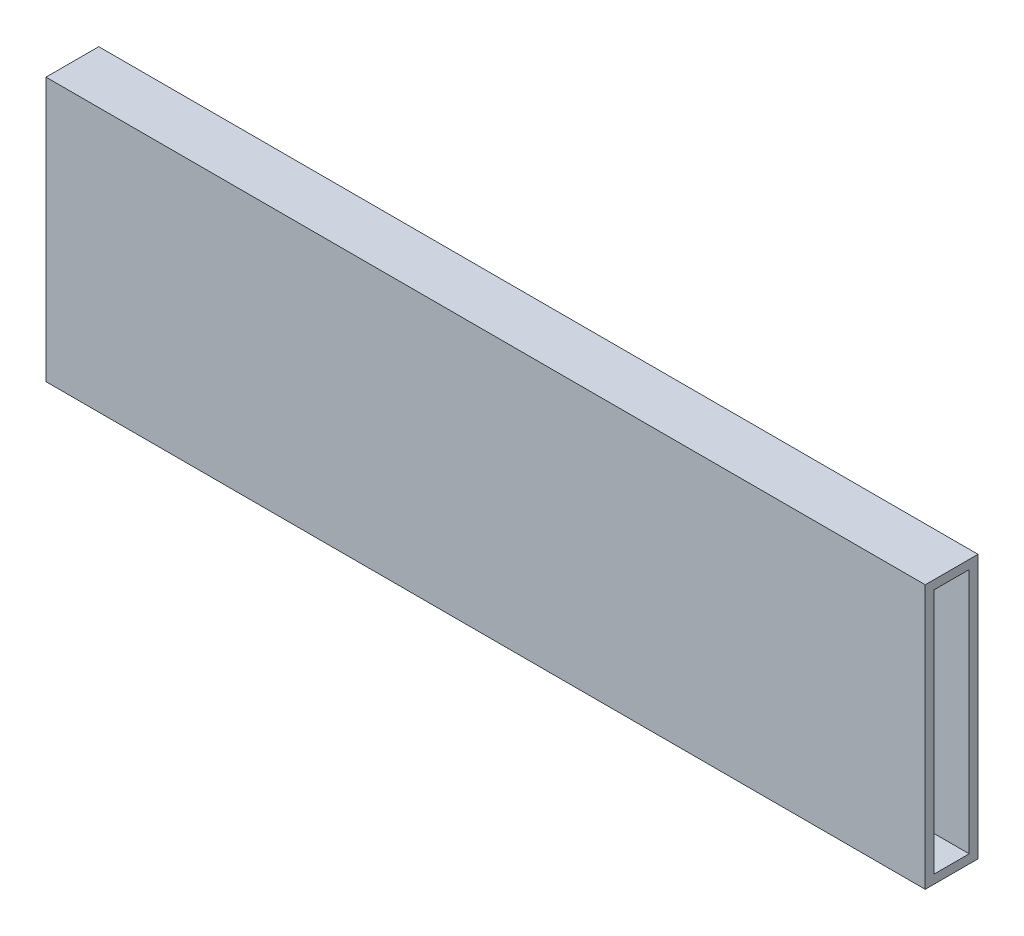
ISO-10303-21;
HEADER;
FILE_DESCRIPTION(('STEP AP214'),'2;1');
FILE_NAME('part.step','',(''),(''),'','','');
FILE_SCHEMA(('AUTOMOTIVE_DESIGN { 1 0 10303 214 1 1 1 1 }'));
ENDSEC;
DATA;
#1=APPLICATION_CONTEXT('core data for automotive mechanical design processes');
#2=APPLICATION_PROTOCOL_DEFINITION('international standard','automotive_design',2000,#1);
#3=PRODUCT_CONTEXT('',#1,'mechanical');
#4=PRODUCT('Part','Part','',(#3));
#5=PRODUCT_RELATED_PRODUCT_CATEGORY('part','',(#4));
#6=PRODUCT_DEFINITION_FORMATION('','',#4);
#7=PRODUCT_DEFINITION_CONTEXT('part definition',#1,'design');
#8=PRODUCT_DEFINITION('design','',#6,#7);
#9=PRODUCT_DEFINITION_SHAPE('','',#8);
#10=(LENGTH_UNIT() NAMED_UNIT(*) SI_UNIT(.MILLI.,.METRE.));
#11=(NAMED_UNIT(*) PLANE_ANGLE_UNIT() SI_UNIT($,.RADIAN.));
#12=(NAMED_UNIT(*) SI_UNIT($,.STERADIAN.) SOLID_ANGLE_UNIT());
#13=UNCERTAINTY_MEASURE_WITH_UNIT(LENGTH_MEASURE(1.E-05),#10,'distance_accuracy_value','');
#14=(GEOMETRIC_REPRESENTATION_CONTEXT(3) GLOBAL_UNCERTAINTY_ASSIGNED_CONTEXT((#13)) GLOBAL_UNIT_ASSIGNED_CONTEXT((#10,
#11,#12)) REPRESENTATION_CONTEXT('',''));
#15=CARTESIAN_POINT('',(0.,0.,0.));
#16=DIRECTION('',(0.,0.,1.));
#17=DIRECTION('',(1.,0.,0.));
#18=AXIS2_PLACEMENT_3D('',#15,#16,#17);
#19=CARTESIAN_POINT('',(-27.6006479437073,15.6987577639752,6.));
#20=DIRECTION('',(1.,0.,0.));
#21=DIRECTION('',(0.,0.,-1.));
#22=AXIS2_PLACEMENT_3D('',#19,#20,#21);
#23=PLANE('',#22);
#24=DIRECTION('',(0.,0.,-1.));
#25=VECTOR('',#24,1.);
#26=CARTESIAN_POINT('',(-27.6006479437073,-13.3012422360248,0.999999999999997));
#27=LINE('',#26,#25);
#28=CARTESIAN_POINT('',(-27.6006479437073,-13.3012422360248,5.));
#29=VERTEX_POINT('',#28);
#30=CARTESIAN_POINT('',(-27.6006479437073,-13.3012422360248,0.999999999999997));
#31=VERTEX_POINT('',#30);
#32=EDGE_CURVE('E111',#29,#31,#27,.T.);
#33=ORIENTED_EDGE('',*,*,#32,.T.);
#34=DIRECTION('',(0.,1.,0.));
#35=VECTOR('',#34,1.);
#36=CARTESIAN_POINT('',(-27.6006479437073,14.6987577639752,1.));
#37=LINE('',#36,#35);
#38=CARTESIAN_POINT('',(-27.6006479437073,14.6987577639752,1.));
#39=VERTEX_POINT('',#38);
#40=EDGE_CURVE('E105',#31,#39,#37,.T.);
#41=ORIENTED_EDGE('',*,*,#40,.T.);
#42=DIRECTION('',(0.,0.,1.));
#43=VECTOR('',#42,1.);
#44=CARTESIAN_POINT('',(-27.6006479437073,14.6987577639752,1.));
#45=LINE('',#44,#43);
#46=CARTESIAN_POINT('',(-27.6006479437073,14.6987577639752,5.));
#47=VERTEX_POINT('',#46);
#48=EDGE_CURVE('E114',#39,#47,#45,.T.);
#49=ORIENTED_EDGE('',*,*,#48,.T.);
#50=DIRECTION('',(0.,-1.,0.));
#51=VECTOR('',#50,1.);
#52=CARTESIAN_POINT('',(-27.6006479437073,14.6987577639752,5.));
#53=LINE('',#52,#51);
#54=EDGE_CURVE('E53',#47,#29,#53,.T.);
#55=ORIENTED_EDGE('',*,*,#54,.T.);
#56=EDGE_LOOP('',(#33,#41,#49,#55));
#57=FACE_BOUND('',#56,.T.);
#58=DIRECTION('',(0.,-1.,0.));
#59=VECTOR('',#58,1.);
#60=CARTESIAN_POINT('',(-27.6006479437073,15.6987577639752,0.));
#61=LINE('',#60,#59);
#62=CARTESIAN_POINT('',(-27.6006479437073,15.6987577639752,0.));
#63=VERTEX_POINT('',#62);
#64=CARTESIAN_POINT('',(-27.6006479437073,-14.3012422360248,0.));
#65=VERTEX_POINT('',#64);
#66=EDGE_CURVE('E135',#63,#65,#61,.T.);
#67=ORIENTED_EDGE('',*,*,#66,.T.);
#68=DIRECTION('',(0.,0.,-1.));
#69=VECTOR('',#68,1.);
#70=CARTESIAN_POINT('',(-27.6006479437073,-14.3012422360248,6.));
#71=LINE('',#70,#69);
#72=CARTESIAN_POINT('',(-27.6006479437073,-14.3012422360248,6.));
#73=VERTEX_POINT('',#72);
#74=EDGE_CURVE('E11',#73,#65,#71,.T.);
#75=ORIENTED_EDGE('',*,*,#74,.F.);
#76=DIRECTION('',(0.,-1.,0.));
#77=VECTOR('',#76,1.);
#78=CARTESIAN_POINT('',(-27.6006479437073,15.6987577639752,6.));
#79=LINE('',#78,#77);
#80=CARTESIAN_POINT('',(-27.6006479437073,15.6987577639752,6.));
#81=VERTEX_POINT('',#80);
#82=EDGE_CURVE('E139',#81,#73,#79,.T.);
#83=ORIENTED_EDGE('',*,*,#82,.F.);
#84=DIRECTION('',(0.,0.,-1.));
#85=VECTOR('',#84,1.);
#86=CARTESIAN_POINT('',(-27.6006479437073,15.6987577639752,6.));
#87=LINE('',#86,#85);
#88=EDGE_CURVE('E149',#81,#63,#87,.T.);
#89=ORIENTED_EDGE('',*,*,#88,.T.);
#90=EDGE_LOOP('',(#67,#75,#83,#89));
#91=FACE_BOUND('',#90,.T.);
#92=ADVANCED_FACE('F39',(#57,#91),#23,.F.);
#93=CARTESIAN_POINT('',(-27.6006479437073,-14.3012422360248,6.));
#94=DIRECTION('',(0.,1.,0.));
#95=DIRECTION('',(0.,0.,1.));
#96=AXIS2_PLACEMENT_3D('',#93,#94,#95);
#97=PLANE('',#96);
#98=DIRECTION('',(1.,0.,0.));
#99=VECTOR('',#98,1.);
#100=CARTESIAN_POINT('',(-27.6006479437073,-14.3012422360248,0.));
#101=LINE('',#100,#99);
#102=CARTESIAN_POINT('',(72.3993520562927,-14.3012422360248,0.));
#103=VERTEX_POINT('',#102);
#104=EDGE_CURVE('E152',#65,#103,#101,.T.);
#105=ORIENTED_EDGE('',*,*,#104,.T.);
#106=DIRECTION('',(0.,0.,-1.));
#107=VECTOR('',#106,1.);
#108=CARTESIAN_POINT('',(72.3993520562927,-14.3012422360248,6.));
#109=LINE('',#108,#107);
#110=CARTESIAN_POINT('',(72.3993520562927,-14.3012422360248,6.));
#111=VERTEX_POINT('',#110);
#112=EDGE_CURVE('E46',#111,#103,#109,.T.);
#113=ORIENTED_EDGE('',*,*,#112,.F.);
#114=DIRECTION('',(1.,0.,0.));
#115=VECTOR('',#114,1.);
#116=CARTESIAN_POINT('',(-27.6006479437073,-14.3012422360248,6.));
#117=LINE('',#116,#115);
#118=EDGE_CURVE('E142',#73,#111,#117,.T.);
#119=ORIENTED_EDGE('',*,*,#118,.F.);
#120=ORIENTED_EDGE('',*,*,#74,.T.);
#121=EDGE_LOOP('',(#105,#113,#119,#120));
#122=FACE_BOUND('',#121,.T.);
#123=ADVANCED_FACE('F181',(#122),#97,.F.);
#124=CARTESIAN_POINT('',(72.3993520562927,15.6987577639752,6.));
#125=DIRECTION('',(-1.,0.,0.));
#126=DIRECTION('',(0.,0.,1.));
#127=AXIS2_PLACEMENT_3D('',#124,#125,#126);
#128=PLANE('',#127);
#129=DIRECTION('',(0.,0.,1.));
#130=VECTOR('',#129,1.);
#131=CARTESIAN_POINT('',(72.3993520562927,14.6987577639752,1.));
#132=LINE('',#131,#130);
#133=CARTESIAN_POINT('',(72.3993520562927,14.6987577639752,1.));
#134=VERTEX_POINT('',#133);
#135=CARTESIAN_POINT('',(72.3993520562927,14.6987577639752,5.));
#136=VERTEX_POINT('',#135);
#137=EDGE_CURVE('E129',#134,#136,#132,.T.);
#138=ORIENTED_EDGE('',*,*,#137,.F.);
#139=DIRECTION('',(0.,1.,0.));
#140=VECTOR('',#139,1.);
#141=CARTESIAN_POINT('',(72.3993520562927,14.6987577639752,1.));
#142=LINE('',#141,#140);
#143=CARTESIAN_POINT('',(72.3993520562927,-13.3012422360248,0.999999999999997));
#144=VERTEX_POINT('',#143);
#145=EDGE_CURVE('E61',#144,#134,#142,.T.);
#146=ORIENTED_EDGE('',*,*,#145,.F.);
#147=DIRECTION('',(0.,0.,-1.));
#148=VECTOR('',#147,1.);
#149=CARTESIAN_POINT('',(72.3993520562927,-13.3012422360248,0.999999999999997));
#150=LINE('',#149,#148);
#151=CARTESIAN_POINT('',(72.3993520562927,-13.3012422360248,5.));
#152=VERTEX_POINT('',#151);
#153=EDGE_CURVE('E120',#152,#144,#150,.T.);
#154=ORIENTED_EDGE('',*,*,#153,.F.);
#155=DIRECTION('',(0.,-1.,0.));
#156=VECTOR('',#155,1.);
#157=CARTESIAN_POINT('',(72.3993520562927,14.6987577639752,5.));
#158=LINE('',#157,#156);
#159=EDGE_CURVE('E123',#136,#152,#158,.T.);
#160=ORIENTED_EDGE('',*,*,#159,.F.);
#161=EDGE_LOOP('',(#138,#146,#154,#160));
#162=FACE_BOUND('',#161,.T.);
#163=DIRECTION('',(0.,1.,0.));
#164=VECTOR('',#163,1.);
#165=CARTESIAN_POINT('',(72.3993520562927,15.6987577639752,0.));
#166=LINE('',#165,#164);
#167=CARTESIAN_POINT('',(72.3993520562927,15.6987577639752,0.));
#168=VERTEX_POINT('',#167);
#169=EDGE_CURVE('E154',#103,#168,#166,.T.);
#170=ORIENTED_EDGE('',*,*,#169,.T.);
#171=DIRECTION('',(0.,0.,-1.));
#172=VECTOR('',#171,1.);
#173=CARTESIAN_POINT('',(72.3993520562927,15.6987577639752,6.));
#174=LINE('',#173,#172);
#175=CARTESIAN_POINT('',(72.3993520562927,15.6987577639752,6.));
#176=VERTEX_POINT('',#175);
#177=EDGE_CURVE('E159',#176,#168,#174,.T.);
#178=ORIENTED_EDGE('',*,*,#177,.F.);
#179=DIRECTION('',(0.,1.,0.));
#180=VECTOR('',#179,1.);
#181=CARTESIAN_POINT('',(72.3993520562927,15.6987577639752,6.));
#182=LINE('',#181,#180);
#183=EDGE_CURVE('E145',#111,#176,#182,.T.);
#184=ORIENTED_EDGE('',*,*,#183,.F.);
#185=ORIENTED_EDGE('',*,*,#112,.T.);
#186=EDGE_LOOP('',(#170,#178,#184,#185));
#187=FACE_BOUND('',#186,.T.);
#188=ADVANCED_FACE('F166',(#162,#187),#128,.F.);
#189=CARTESIAN_POINT('',(-27.6006479437073,15.6987577639752,6.));
#190=DIRECTION('',(0.,-1.,0.));
#191=DIRECTION('',(0.,0.,-1.));
#192=AXIS2_PLACEMENT_3D('',#189,#190,#191);
#193=PLANE('',#192);
#194=DIRECTION('',(-1.,0.,0.));
#195=VECTOR('',#194,1.);
#196=CARTESIAN_POINT('',(-27.6006479437073,15.6987577639752,0.));
#197=LINE('',#196,#195);
#198=EDGE_CURVE('E143',#168,#63,#197,.T.);
#199=ORIENTED_EDGE('',*,*,#198,.T.);
#200=ORIENTED_EDGE('',*,*,#88,.F.);
#201=DIRECTION('',(-1.,0.,0.));
#202=VECTOR('',#201,1.);
#203=CARTESIAN_POINT('',(-27.6006479437073,15.6987577639752,6.));
#204=LINE('',#203,#202);
#205=EDGE_CURVE('E147',#176,#81,#204,.T.);
#206=ORIENTED_EDGE('',*,*,#205,.F.);
#207=ORIENTED_EDGE('',*,*,#177,.T.);
#208=EDGE_LOOP('',(#199,#200,#206,#207));
#209=FACE_BOUND('',#208,.T.);
#210=ADVANCED_FACE('F175',(#209),#193,.F.);
#211=CARTESIAN_POINT('',(0.,0.,6.));
#212=DIRECTION('',(0.,0.,1.));
#213=DIRECTION('',(1.,0.,0.));
#214=AXIS2_PLACEMENT_3D('',#211,#212,#213);
#215=PLANE('',#214);
#216=ORIENTED_EDGE('',*,*,#82,.T.);
#217=ORIENTED_EDGE('',*,*,#118,.T.);
#218=ORIENTED_EDGE('',*,*,#183,.T.);
#219=ORIENTED_EDGE('',*,*,#205,.T.);
#220=EDGE_LOOP('',(#216,#217,#218,#219));
#221=FACE_BOUND('',#220,.T.);
#222=ADVANCED_FACE('F180',(#221),#215,.T.);
#223=CARTESIAN_POINT('',(0.,0.,0.));
#224=DIRECTION('',(0.,0.,1.));
#225=DIRECTION('',(1.,0.,0.));
#226=AXIS2_PLACEMENT_3D('',#223,#224,#225);
#227=PLANE('',#226);
#228=ORIENTED_EDGE('',*,*,#66,.F.);
#229=ORIENTED_EDGE('',*,*,#198,.F.);
#230=ORIENTED_EDGE('',*,*,#169,.F.);
#231=ORIENTED_EDGE('',*,*,#104,.F.);
#232=EDGE_LOOP('',(#228,#229,#230,#231));
#233=FACE_BOUND('',#232,.T.);
#234=ADVANCED_FACE('F172',(#233),#227,.F.);
#235=CARTESIAN_POINT('',(-27.6006479437073,14.6987577639752,1.));
#236=DIRECTION('',(0.,0.,-1.));
#237=DIRECTION('',(0.,1.,0.));
#238=AXIS2_PLACEMENT_3D('',#235,#236,#237);
#239=PLANE('',#238);
#240=ORIENTED_EDGE('',*,*,#145,.T.);
#241=DIRECTION('',(1.,0.,0.));
#242=VECTOR('',#241,1.);
#243=CARTESIAN_POINT('',(-27.6006479437073,14.6987577639752,1.));
#244=LINE('',#243,#242);
#245=EDGE_CURVE('E101',#39,#134,#244,.T.);
#246=ORIENTED_EDGE('',*,*,#245,.F.);
#247=ORIENTED_EDGE('',*,*,#40,.F.);
#248=DIRECTION('',(1.,0.,0.));
#249=VECTOR('',#248,1.);
#250=CARTESIAN_POINT('',(-27.6006479437073,-13.3012422360248,0.999999999999997));
#251=LINE('',#250,#249);
#252=EDGE_CURVE('E133',#31,#144,#251,.T.);
#253=ORIENTED_EDGE('',*,*,#252,.T.);
#254=EDGE_LOOP('',(#240,#246,#247,#253));
#255=FACE_BOUND('',#254,.T.);
#256=ADVANCED_FACE('F103',(#255),#239,.F.);
#257=CARTESIAN_POINT('',(-27.6006479437073,-13.3012422360248,0.999999999999997));
#258=DIRECTION('',(0.,-1.,0.));
#259=DIRECTION('',(0.,0.,-1.));
#260=AXIS2_PLACEMENT_3D('',#257,#258,#259);
#261=PLANE('',#260);
#262=ORIENTED_EDGE('',*,*,#153,.T.);
#263=ORIENTED_EDGE('',*,*,#252,.F.);
#264=ORIENTED_EDGE('',*,*,#32,.F.);
#265=DIRECTION('',(1.,0.,0.));
#266=VECTOR('',#265,1.);
#267=CARTESIAN_POINT('',(-27.6006479437073,-13.3012422360248,5.));
#268=LINE('',#267,#266);
#269=EDGE_CURVE('E136',#29,#152,#268,.T.);
#270=ORIENTED_EDGE('',*,*,#269,.T.);
#271=EDGE_LOOP('',(#262,#263,#264,#270));
#272=FACE_BOUND('',#271,.T.);
#273=ADVANCED_FACE('F200',(#272),#261,.F.);
#274=CARTESIAN_POINT('',(-27.6006479437073,14.6987577639752,5.));
#275=DIRECTION('',(0.,0.,1.));
#276=DIRECTION('',(0.,-1.,0.));
#277=AXIS2_PLACEMENT_3D('',#274,#275,#276);
#278=PLANE('',#277);
#279=ORIENTED_EDGE('',*,*,#159,.T.);
#280=ORIENTED_EDGE('',*,*,#269,.F.);
#281=ORIENTED_EDGE('',*,*,#54,.F.);
#282=DIRECTION('',(1.,0.,0.));
#283=VECTOR('',#282,1.);
#284=CARTESIAN_POINT('',(-27.6006479437073,14.6987577639752,5.));
#285=LINE('',#284,#283);
#286=EDGE_CURVE('E110',#47,#136,#285,.T.);
#287=ORIENTED_EDGE('',*,*,#286,.T.);
#288=EDGE_LOOP('',(#279,#280,#281,#287));
#289=FACE_BOUND('',#288,.T.);
#290=ADVANCED_FACE('F203',(#289),#278,.F.);
#291=CARTESIAN_POINT('',(-27.6006479437073,14.6987577639752,1.));
#292=DIRECTION('',(0.,1.,0.));
#293=DIRECTION('',(0.,0.,1.));
#294=AXIS2_PLACEMENT_3D('',#291,#292,#293);
#295=PLANE('',#294);
#296=ORIENTED_EDGE('',*,*,#137,.T.);
#297=ORIENTED_EDGE('',*,*,#286,.F.);
#298=ORIENTED_EDGE('',*,*,#48,.F.);
#299=ORIENTED_EDGE('',*,*,#245,.T.);
#300=EDGE_LOOP('',(#296,#297,#298,#299));
#301=FACE_BOUND('',#300,.T.);
#302=ADVANCED_FACE('F115',(#301),#295,.F.);
#303=CLOSED_SHELL('',(#92,#123,#188,#210,#222,#234,#256,#273,#290,#302));
#304=MANIFOLD_SOLID_BREP('B2',#303);
#305=ADVANCED_BREP_SHAPE_REPRESENTATION('',(#18,#304),#14);
#306=SHAPE_DEFINITION_REPRESENTATION(#9,#305);
ENDSEC;
END-ISO-10303-21;
